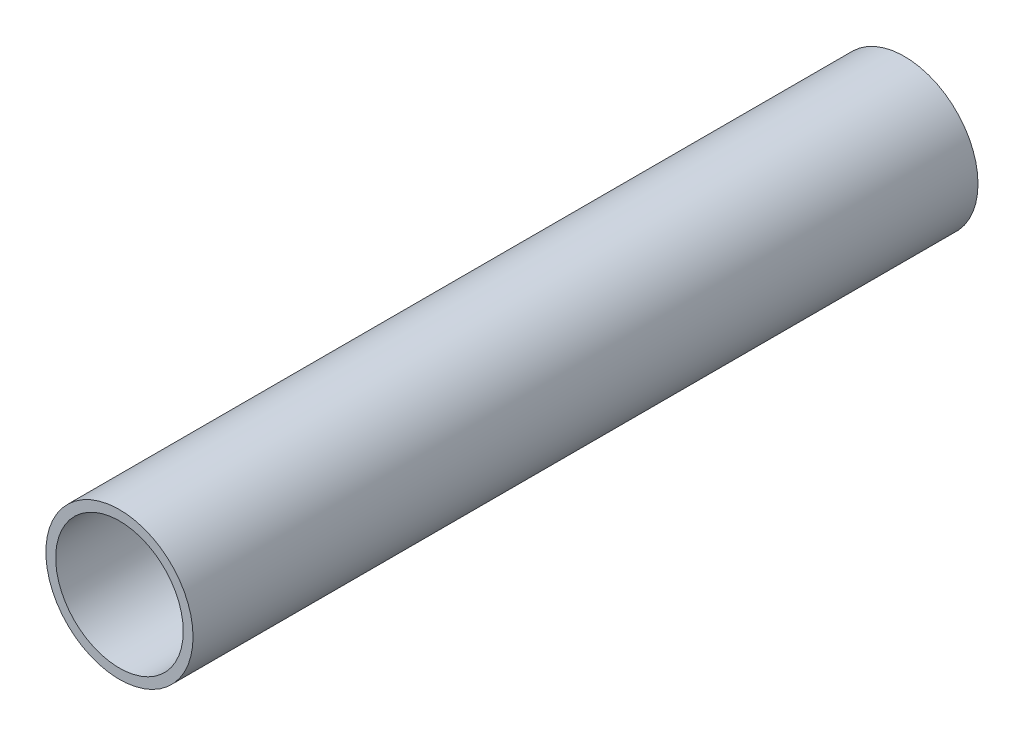
ISO-10303-21;
HEADER;
FILE_DESCRIPTION(('STEP AP214'),'2;1');
FILE_NAME('part.step','',(''),(''),'','','');
FILE_SCHEMA(('AUTOMOTIVE_DESIGN { 1 0 10303 214 1 1 1 1 }'));
ENDSEC;
DATA;
#1=APPLICATION_CONTEXT('core data for automotive mechanical design processes');
#2=APPLICATION_PROTOCOL_DEFINITION('international standard','automotive_design',2000,#1);
#3=PRODUCT_CONTEXT('',#1,'mechanical');
#4=PRODUCT('Part','Part','',(#3));
#5=PRODUCT_RELATED_PRODUCT_CATEGORY('part','',(#4));
#6=PRODUCT_DEFINITION_FORMATION('','',#4);
#7=PRODUCT_DEFINITION_CONTEXT('part definition',#1,'design');
#8=PRODUCT_DEFINITION('design','',#6,#7);
#9=PRODUCT_DEFINITION_SHAPE('','',#8);
#10=(LENGTH_UNIT() NAMED_UNIT(*) SI_UNIT(.MILLI.,.METRE.));
#11=(NAMED_UNIT(*) PLANE_ANGLE_UNIT() SI_UNIT($,.RADIAN.));
#12=(NAMED_UNIT(*) SI_UNIT($,.STERADIAN.) SOLID_ANGLE_UNIT());
#13=UNCERTAINTY_MEASURE_WITH_UNIT(LENGTH_MEASURE(1.E-05),#10,'distance_accuracy_value','');
#14=(GEOMETRIC_REPRESENTATION_CONTEXT(3) GLOBAL_UNCERTAINTY_ASSIGNED_CONTEXT((#13)) GLOBAL_UNIT_ASSIGNED_CONTEXT((#10,
#11,#12)) REPRESENTATION_CONTEXT('',''));
#15=CARTESIAN_POINT('',(0.,0.,0.));
#16=DIRECTION('',(0.,0.,1.));
#17=DIRECTION('',(1.,0.,0.));
#18=AXIS2_PLACEMENT_3D('',#15,#16,#17);
#19=CARTESIAN_POINT('',(0.,0.,160.));
#20=DIRECTION('',(0.,0.,1.));
#21=DIRECTION('',(1.,0.,0.));
#22=AXIS2_PLACEMENT_3D('',#19,#20,#21);
#23=PLANE('',#22);
#24=CARTESIAN_POINT('',(0.,0.,160.));
#25=DIRECTION('',(0.,0.,1.));
#26=DIRECTION('',(1.,0.,0.));
#27=AXIS2_PLACEMENT_3D('',#24,#25,#26);
#28=CIRCLE('',#27,15.);
#29=CARTESIAN_POINT('',(15.,0.,160.));
#30=VERTEX_POINT('',#29);
#31=EDGE_CURVE('E10',#30,#30,#28,.T.);
#32=ORIENTED_EDGE('',*,*,#31,.T.);
#33=EDGE_LOOP('',(#32));
#34=FACE_BOUND('',#33,.T.);
#35=CARTESIAN_POINT('',(0.,0.,160.));
#36=DIRECTION('',(0.,0.,1.));
#37=DIRECTION('',(1.,0.,0.));
#38=AXIS2_PLACEMENT_3D('',#35,#36,#37);
#39=CIRCLE('',#38,13.);
#40=CARTESIAN_POINT('',(13.,0.,160.));
#41=VERTEX_POINT('',#40);
#42=EDGE_CURVE('E42',#41,#41,#39,.T.);
#43=ORIENTED_EDGE('',*,*,#42,.F.);
#44=EDGE_LOOP('',(#43));
#45=FACE_BOUND('',#44,.T.);
#46=ADVANCED_FACE('F31',(#34,#45),#23,.T.);
#47=CARTESIAN_POINT('',(0.,0.,0.));
#48=DIRECTION('',(0.,0.,1.));
#49=DIRECTION('',(1.,0.,0.));
#50=AXIS2_PLACEMENT_3D('',#47,#48,#49);
#51=PLANE('',#50);
#52=CARTESIAN_POINT('',(0.,0.,0.));
#53=DIRECTION('',(0.,0.,1.));
#54=DIRECTION('',(1.,0.,0.));
#55=AXIS2_PLACEMENT_3D('',#52,#53,#54);
#56=CIRCLE('',#55,15.);
#57=CARTESIAN_POINT('',(15.,0.,0.));
#58=VERTEX_POINT('',#57);
#59=EDGE_CURVE('E35',#58,#58,#56,.T.);
#60=ORIENTED_EDGE('',*,*,#59,.F.);
#61=EDGE_LOOP('',(#60));
#62=FACE_BOUND('',#61,.T.);
#63=CARTESIAN_POINT('',(0.,0.,0.));
#64=DIRECTION('',(0.,0.,1.));
#65=DIRECTION('',(1.,0.,0.));
#66=AXIS2_PLACEMENT_3D('',#63,#64,#65);
#67=CIRCLE('',#66,13.);
#68=CARTESIAN_POINT('',(13.,0.,0.));
#69=VERTEX_POINT('',#68);
#70=EDGE_CURVE('E44',#69,#69,#67,.T.);
#71=ORIENTED_EDGE('',*,*,#70,.T.);
#72=EDGE_LOOP('',(#71));
#73=FACE_BOUND('',#72,.T.);
#74=ADVANCED_FACE('F54',(#62,#73),#51,.F.);
#75=CARTESIAN_POINT('',(0.,0.,160.));
#76=DIRECTION('',(0.,0.,-1.));
#77=DIRECTION('',(-1.,0.,0.));
#78=AXIS2_PLACEMENT_3D('',#75,#76,#77);
#79=CYLINDRICAL_SURFACE('',#78,15.);
#80=ORIENTED_EDGE('',*,*,#31,.F.);
#81=EDGE_LOOP('',(#80));
#82=FACE_BOUND('',#81,.T.);
#83=ORIENTED_EDGE('',*,*,#59,.T.);
#84=EDGE_LOOP('',(#83));
#85=FACE_BOUND('',#84,.T.);
#86=ADVANCED_FACE('F33',(#82,#85),#79,.T.);
#87=CARTESIAN_POINT('',(0.,0.,160.));
#88=DIRECTION('',(0.,0.,-1.));
#89=DIRECTION('',(-1.,0.,0.));
#90=AXIS2_PLACEMENT_3D('',#87,#88,#89);
#91=CYLINDRICAL_SURFACE('',#90,13.);
#92=ORIENTED_EDGE('',*,*,#42,.T.);
#93=EDGE_LOOP('',(#92));
#94=FACE_BOUND('',#93,.T.);
#95=ORIENTED_EDGE('',*,*,#70,.F.);
#96=EDGE_LOOP('',(#95));
#97=FACE_BOUND('',#96,.T.);
#98=ADVANCED_FACE('F50',(#94,#97),#91,.F.);
#99=CLOSED_SHELL('',(#46,#74,#86,#98));
#100=MANIFOLD_SOLID_BREP('B2',#99);
#101=ADVANCED_BREP_SHAPE_REPRESENTATION('',(#18,#100),#14);
#102=SHAPE_DEFINITION_REPRESENTATION(#9,#101);
ENDSEC;
END-ISO-10303-21;
